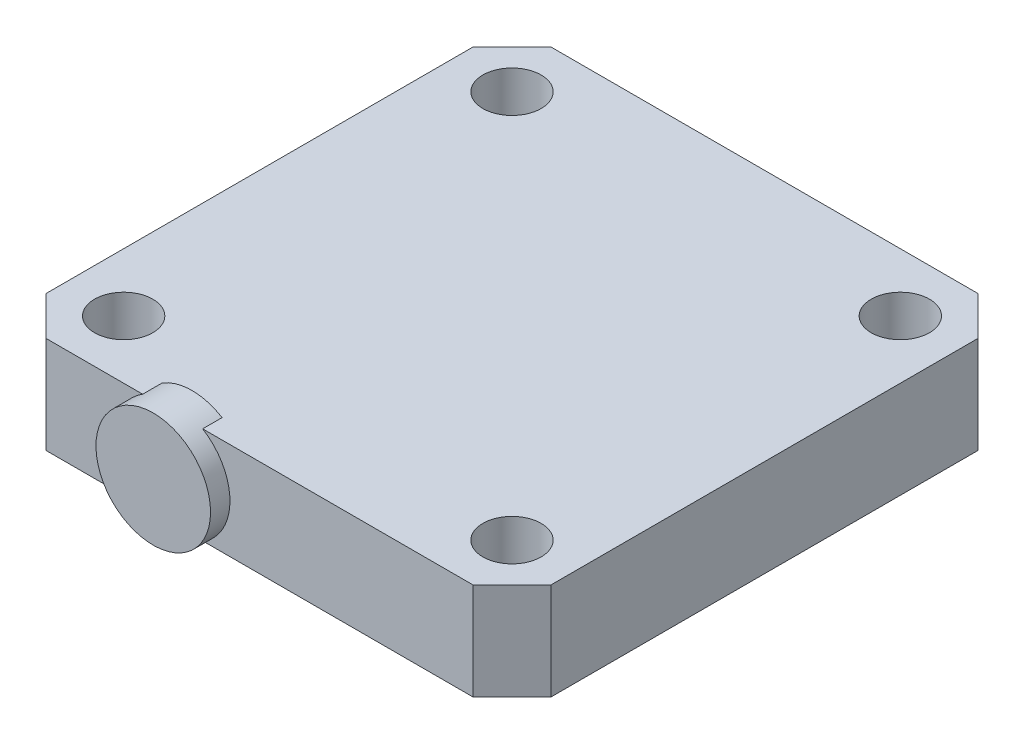
ISO-10303-21;
HEADER;
FILE_DESCRIPTION(('STEP AP214'),'2;1');
FILE_NAME('part.step','',(''),(''),'','','');
FILE_SCHEMA(('AUTOMOTIVE_DESIGN { 1 0 10303 214 1 1 1 1 }'));
ENDSEC;
DATA;
#1=APPLICATION_CONTEXT('core data for automotive mechanical design processes');
#2=APPLICATION_PROTOCOL_DEFINITION('international standard','automotive_design',2000,#1);
#3=PRODUCT_CONTEXT('',#1,'mechanical');
#4=PRODUCT('Part','Part','',(#3));
#5=PRODUCT_RELATED_PRODUCT_CATEGORY('part','',(#4));
#6=PRODUCT_DEFINITION_FORMATION('','',#4);
#7=PRODUCT_DEFINITION_CONTEXT('part definition',#1,'design');
#8=PRODUCT_DEFINITION('design','',#6,#7);
#9=PRODUCT_DEFINITION_SHAPE('','',#8);
#10=(LENGTH_UNIT() NAMED_UNIT(*) SI_UNIT(.MILLI.,.METRE.));
#11=(NAMED_UNIT(*) PLANE_ANGLE_UNIT() SI_UNIT($,.RADIAN.));
#12=(NAMED_UNIT(*) SI_UNIT($,.STERADIAN.) SOLID_ANGLE_UNIT());
#13=UNCERTAINTY_MEASURE_WITH_UNIT(LENGTH_MEASURE(1.E-05),#10,'distance_accuracy_value','');
#14=(GEOMETRIC_REPRESENTATION_CONTEXT(3) GLOBAL_UNCERTAINTY_ASSIGNED_CONTEXT((#13)) GLOBAL_UNIT_ASSIGNED_CONTEXT((#10,
#11,#12)) REPRESENTATION_CONTEXT('',''));
#15=CARTESIAN_POINT('',(0.,0.,0.));
#16=DIRECTION('',(0.,0.,1.));
#17=DIRECTION('',(1.,0.,0.));
#18=AXIS2_PLACEMENT_3D('',#15,#16,#17);
#19=CARTESIAN_POINT('',(0.,5.,0.));
#20=DIRECTION('',(0.,-1.,0.));
#21=DIRECTION('',(0.,0.,-1.));
#22=AXIS2_PLACEMENT_3D('',#19,#20,#21);
#23=PLANE('',#22);
#24=CARTESIAN_POINT('',(-10.,5.,10.));
#25=DIRECTION('',(0.,1.,0.));
#26=DIRECTION('',(0.,0.,1.));
#27=AXIS2_PLACEMENT_3D('',#24,#25,#26);
#28=CIRCLE('',#27,1.5);
#29=CARTESIAN_POINT('',(-10.,5.,11.5));
#30=VERTEX_POINT('',#29);
#31=EDGE_CURVE('E226',#30,#30,#28,.T.);
#32=ORIENTED_EDGE('',*,*,#31,.F.);
#33=EDGE_LOOP('',(#32));
#34=FACE_BOUND('',#33,.T.);
#35=CARTESIAN_POINT('',(10.,5.,10.));
#36=DIRECTION('',(0.,1.,0.));
#37=DIRECTION('',(0.,0.,1.));
#38=AXIS2_PLACEMENT_3D('',#35,#36,#37);
#39=CIRCLE('',#38,1.5);
#40=CARTESIAN_POINT('',(10.,5.,11.5));
#41=VERTEX_POINT('',#40);
#42=EDGE_CURVE('E220',#41,#41,#39,.T.);
#43=ORIENTED_EDGE('',*,*,#42,.F.);
#44=EDGE_LOOP('',(#43));
#45=FACE_BOUND('',#44,.T.);
#46=CARTESIAN_POINT('',(10.,5.,-10.));
#47=DIRECTION('',(0.,1.,0.));
#48=DIRECTION('',(0.,0.,1.));
#49=AXIS2_PLACEMENT_3D('',#46,#47,#48);
#50=CIRCLE('',#49,1.5);
#51=CARTESIAN_POINT('',(10.,5.,-8.5));
#52=VERTEX_POINT('',#51);
#53=EDGE_CURVE('E214',#52,#52,#50,.T.);
#54=ORIENTED_EDGE('',*,*,#53,.F.);
#55=EDGE_LOOP('',(#54));
#56=FACE_BOUND('',#55,.T.);
#57=CARTESIAN_POINT('',(-10.,5.,-9.99999999999999));
#58=DIRECTION('',(0.,1.,0.));
#59=DIRECTION('',(0.,0.,1.));
#60=AXIS2_PLACEMENT_3D('',#57,#58,#59);
#61=CIRCLE('',#60,1.5);
#62=CARTESIAN_POINT('',(-10.,5.,-8.49999999999999));
#63=VERTEX_POINT('',#62);
#64=EDGE_CURVE('E194',#63,#63,#61,.T.);
#65=ORIENTED_EDGE('',*,*,#64,.F.);
#66=EDGE_LOOP('',(#65));
#67=FACE_BOUND('',#66,.T.);
#68=DIRECTION('',(0.,0.,-1.));
#69=VECTOR('',#68,1.);
#70=CARTESIAN_POINT('',(-6.0206778383415,5.,14.));
#71=LINE('',#70,#69);
#72=CARTESIAN_POINT('',(-6.0206778383415,5.,12.));
#73=VERTEX_POINT('',#72);
#74=CARTESIAN_POINT('',(-6.0206778383415,5.,13.));
#75=VERTEX_POINT('',#74);
#76=EDGE_CURVE('E58',#73,#75,#71,.F.);
#77=ORIENTED_EDGE('',*,*,#76,.F.);
#78=DIRECTION('',(-1.,0.,0.));
#79=VECTOR('',#78,1.);
#80=CARTESIAN_POINT('',(0.,5.,12.));
#81=LINE('',#80,#79);
#82=CARTESIAN_POINT('',(-2.93184259864385,5.,12.));
#83=VERTEX_POINT('',#82);
#84=EDGE_CURVE('E62',#83,#73,#81,.T.);
#85=ORIENTED_EDGE('',*,*,#84,.F.);
#86=DIRECTION('',(0.,0.,-1.));
#87=VECTOR('',#86,1.);
#88=CARTESIAN_POINT('',(-2.93184259864385,5.,14.));
#89=LINE('',#88,#87);
#90=CARTESIAN_POINT('',(-2.93184259864385,5.,13.));
#91=VERTEX_POINT('',#90);
#92=EDGE_CURVE('E235',#91,#83,#89,.T.);
#93=ORIENTED_EDGE('',*,*,#92,.F.);
#94=DIRECTION('',(1.,0.,0.));
#95=VECTOR('',#94,1.);
#96=CARTESIAN_POINT('',(11.,5.,13.));
#97=LINE('',#96,#95);
#98=CARTESIAN_POINT('',(11.,5.,13.));
#99=VERTEX_POINT('',#98);
#100=EDGE_CURVE('E202',#91,#99,#97,.T.);
#101=ORIENTED_EDGE('',*,*,#100,.T.);
#102=DIRECTION('',(0.707106781186548,0.,-0.707106781186548));
#103=VECTOR('',#102,1.);
#104=CARTESIAN_POINT('',(13.,5.,11.));
#105=LINE('',#104,#103);
#106=CARTESIAN_POINT('',(13.,5.,11.));
#107=VERTEX_POINT('',#106);
#108=EDGE_CURVE('E198',#99,#107,#105,.T.);
#109=ORIENTED_EDGE('',*,*,#108,.T.);
#110=DIRECTION('',(0.,0.,-1.));
#111=VECTOR('',#110,1.);
#112=CARTESIAN_POINT('',(13.,5.,11.));
#113=LINE('',#112,#111);
#114=CARTESIAN_POINT('',(13.,5.,-11.));
#115=VERTEX_POINT('',#114);
#116=EDGE_CURVE('E196',#107,#115,#113,.T.);
#117=ORIENTED_EDGE('',*,*,#116,.T.);
#118=DIRECTION('',(-0.707106781186548,0.,-0.707106781186548));
#119=VECTOR('',#118,1.);
#120=CARTESIAN_POINT('',(13.,5.,-11.));
#121=LINE('',#120,#119);
#122=CARTESIAN_POINT('',(11.,5.,-13.));
#123=VERTEX_POINT('',#122);
#124=EDGE_CURVE('E178',#115,#123,#121,.T.);
#125=ORIENTED_EDGE('',*,*,#124,.T.);
#126=DIRECTION('',(-1.,0.,0.));
#127=VECTOR('',#126,1.);
#128=CARTESIAN_POINT('',(11.,5.,-13.));
#129=LINE('',#128,#127);
#130=CARTESIAN_POINT('',(-11.,5.,-13.));
#131=VERTEX_POINT('',#130);
#132=EDGE_CURVE('E181',#123,#131,#129,.T.);
#133=ORIENTED_EDGE('',*,*,#132,.T.);
#134=DIRECTION('',(-0.707106781186548,0.,0.707106781186548));
#135=VECTOR('',#134,1.);
#136=CARTESIAN_POINT('',(-11.,5.,-13.));
#137=LINE('',#136,#135);
#138=CARTESIAN_POINT('',(-13.,5.,-11.));
#139=VERTEX_POINT('',#138);
#140=EDGE_CURVE('E207',#131,#139,#137,.T.);
#141=ORIENTED_EDGE('',*,*,#140,.T.);
#142=DIRECTION('',(0.,0.,1.));
#143=VECTOR('',#142,1.);
#144=CARTESIAN_POINT('',(-13.,5.,11.));
#145=LINE('',#144,#143);
#146=CARTESIAN_POINT('',(-13.,5.,11.));
#147=VERTEX_POINT('',#146);
#148=EDGE_CURVE('E205',#139,#147,#145,.T.);
#149=ORIENTED_EDGE('',*,*,#148,.T.);
#150=DIRECTION('',(0.707106781186548,0.,0.707106781186548));
#151=VECTOR('',#150,1.);
#152=CARTESIAN_POINT('',(-11.,5.,13.));
#153=LINE('',#152,#151);
#154=CARTESIAN_POINT('',(-11.,5.,13.));
#155=VERTEX_POINT('',#154);
#156=EDGE_CURVE('E203',#147,#155,#153,.T.);
#157=ORIENTED_EDGE('',*,*,#156,.T.);
#158=EDGE_CURVE('E200',#155,#75,#97,.T.);
#159=ORIENTED_EDGE('',*,*,#158,.T.);
#160=EDGE_LOOP('',(#77,#85,#93,#101,#109,#117,#125,#133,#141,#149,#157,#159));
#161=FACE_BOUND('',#160,.T.);
#162=ADVANCED_FACE('F43',(#34,#45,#56,#67,#161),#23,.F.);
#163=CARTESIAN_POINT('',(0.,0.,0.));
#164=DIRECTION('',(0.,-1.,0.));
#165=DIRECTION('',(0.,0.,-1.));
#166=AXIS2_PLACEMENT_3D('',#163,#164,#165);
#167=PLANE('',#166);
#168=CARTESIAN_POINT('',(10.,0.,10.));
#169=DIRECTION('',(0.,1.,0.));
#170=DIRECTION('',(0.,0.,1.));
#171=AXIS2_PLACEMENT_3D('',#168,#169,#170);
#172=CIRCLE('',#171,1.5);
#173=CARTESIAN_POINT('',(10.,0.,11.5));
#174=VERTEX_POINT('',#173);
#175=EDGE_CURVE('E223',#174,#174,#172,.T.);
#176=ORIENTED_EDGE('',*,*,#175,.T.);
#177=EDGE_LOOP('',(#176));
#178=FACE_BOUND('',#177,.T.);
#179=CARTESIAN_POINT('',(-10.,0.,-9.99999999999999));
#180=DIRECTION('',(0.,1.,0.));
#181=DIRECTION('',(0.,0.,1.));
#182=AXIS2_PLACEMENT_3D('',#179,#180,#181);
#183=CIRCLE('',#182,1.5);
#184=CARTESIAN_POINT('',(-10.,0.,-8.49999999999999));
#185=VERTEX_POINT('',#184);
#186=EDGE_CURVE('E211',#185,#185,#183,.T.);
#187=ORIENTED_EDGE('',*,*,#186,.T.);
#188=EDGE_LOOP('',(#187));
#189=FACE_BOUND('',#188,.T.);
#190=CARTESIAN_POINT('',(10.,0.,-10.));
#191=DIRECTION('',(0.,1.,0.));
#192=DIRECTION('',(0.,0.,1.));
#193=AXIS2_PLACEMENT_3D('',#190,#191,#192);
#194=CIRCLE('',#193,1.5);
#195=CARTESIAN_POINT('',(10.,0.,-8.5));
#196=VERTEX_POINT('',#195);
#197=EDGE_CURVE('E217',#196,#196,#194,.T.);
#198=ORIENTED_EDGE('',*,*,#197,.T.);
#199=EDGE_LOOP('',(#198));
#200=FACE_BOUND('',#199,.T.);
#201=CARTESIAN_POINT('',(-10.,0.,10.));
#202=DIRECTION('',(0.,1.,0.));
#203=DIRECTION('',(0.,0.,1.));
#204=AXIS2_PLACEMENT_3D('',#201,#202,#203);
#205=CIRCLE('',#204,1.5);
#206=CARTESIAN_POINT('',(-10.,0.,11.5));
#207=VERTEX_POINT('',#206);
#208=EDGE_CURVE('E229',#207,#207,#205,.T.);
#209=ORIENTED_EDGE('',*,*,#208,.T.);
#210=EDGE_LOOP('',(#209));
#211=FACE_BOUND('',#210,.T.);
#212=DIRECTION('',(-1.,0.,0.));
#213=VECTOR('',#212,1.);
#214=CARTESIAN_POINT('',(0.,0.,12.));
#215=LINE('',#214,#213);
#216=CARTESIAN_POINT('',(-2.88774457044834,0.,12.));
#217=VERTEX_POINT('',#216);
#218=CARTESIAN_POINT('',(-6.064775866537,0.,12.));
#219=VERTEX_POINT('',#218);
#220=EDGE_CURVE('E11',#217,#219,#215,.T.);
#221=ORIENTED_EDGE('',*,*,#220,.T.);
#222=DIRECTION('',(0.,0.,-1.));
#223=VECTOR('',#222,1.);
#224=CARTESIAN_POINT('',(-6.064775866537,0.,14.));
#225=LINE('',#224,#223);
#226=CARTESIAN_POINT('',(-6.064775866537,0.,13.));
#227=VERTEX_POINT('',#226);
#228=EDGE_CURVE('E144',#219,#227,#225,.F.);
#229=ORIENTED_EDGE('',*,*,#228,.T.);
#230=DIRECTION('',(1.,0.,0.));
#231=VECTOR('',#230,1.);
#232=CARTESIAN_POINT('',(11.,0.,13.));
#233=LINE('',#232,#231);
#234=CARTESIAN_POINT('',(-11.,0.,13.));
#235=VERTEX_POINT('',#234);
#236=EDGE_CURVE('E130',#235,#227,#233,.T.);
#237=ORIENTED_EDGE('',*,*,#236,.F.);
#238=DIRECTION('',(0.707106781186548,0.,0.707106781186548));
#239=VECTOR('',#238,1.);
#240=CARTESIAN_POINT('',(-11.,0.,13.));
#241=LINE('',#240,#239);
#242=CARTESIAN_POINT('',(-13.,0.,11.));
#243=VERTEX_POINT('',#242);
#244=EDGE_CURVE('E185',#243,#235,#241,.T.);
#245=ORIENTED_EDGE('',*,*,#244,.F.);
#246=DIRECTION('',(0.,0.,1.));
#247=VECTOR('',#246,1.);
#248=CARTESIAN_POINT('',(-13.,0.,11.));
#249=LINE('',#248,#247);
#250=CARTESIAN_POINT('',(-13.,0.,-11.));
#251=VERTEX_POINT('',#250);
#252=EDGE_CURVE('E187',#251,#243,#249,.T.);
#253=ORIENTED_EDGE('',*,*,#252,.F.);
#254=DIRECTION('',(-0.707106781186548,0.,0.707106781186548));
#255=VECTOR('',#254,1.);
#256=CARTESIAN_POINT('',(-11.,0.,-13.));
#257=LINE('',#256,#255);
#258=CARTESIAN_POINT('',(-11.,0.,-13.));
#259=VERTEX_POINT('',#258);
#260=EDGE_CURVE('E189',#259,#251,#257,.T.);
#261=ORIENTED_EDGE('',*,*,#260,.F.);
#262=DIRECTION('',(-1.,0.,0.));
#263=VECTOR('',#262,1.);
#264=CARTESIAN_POINT('',(11.,0.,-13.));
#265=LINE('',#264,#263);
#266=CARTESIAN_POINT('',(11.,0.,-13.));
#267=VERTEX_POINT('',#266);
#268=EDGE_CURVE('E191',#267,#259,#265,.T.);
#269=ORIENTED_EDGE('',*,*,#268,.F.);
#270=DIRECTION('',(-0.707106781186548,0.,-0.707106781186548));
#271=VECTOR('',#270,1.);
#272=CARTESIAN_POINT('',(13.,0.,-11.));
#273=LINE('',#272,#271);
#274=CARTESIAN_POINT('',(13.,0.,-11.));
#275=VERTEX_POINT('',#274);
#276=EDGE_CURVE('E179',#275,#267,#273,.T.);
#277=ORIENTED_EDGE('',*,*,#276,.F.);
#278=DIRECTION('',(0.,0.,-1.));
#279=VECTOR('',#278,1.);
#280=CARTESIAN_POINT('',(13.,0.,11.));
#281=LINE('',#280,#279);
#282=CARTESIAN_POINT('',(13.,0.,11.));
#283=VERTEX_POINT('',#282);
#284=EDGE_CURVE('E182',#283,#275,#281,.T.);
#285=ORIENTED_EDGE('',*,*,#284,.F.);
#286=DIRECTION('',(0.707106781186548,0.,-0.707106781186548));
#287=VECTOR('',#286,1.);
#288=CARTESIAN_POINT('',(13.,0.,11.));
#289=LINE('',#288,#287);
#290=CARTESIAN_POINT('',(11.,0.,13.));
#291=VERTEX_POINT('',#290);
#292=EDGE_CURVE('E140',#291,#283,#289,.T.);
#293=ORIENTED_EDGE('',*,*,#292,.F.);
#294=CARTESIAN_POINT('',(-2.88774457044834,0.,13.));
#295=VERTEX_POINT('',#294);
#296=EDGE_CURVE('E141',#295,#291,#233,.T.);
#297=ORIENTED_EDGE('',*,*,#296,.F.);
#298=DIRECTION('',(0.,0.,-1.));
#299=VECTOR('',#298,1.);
#300=CARTESIAN_POINT('',(-2.88774457044834,0.,14.));
#301=LINE('',#300,#299);
#302=EDGE_CURVE('E237',#295,#217,#301,.T.);
#303=ORIENTED_EDGE('',*,*,#302,.T.);
#304=EDGE_LOOP('',(#221,#229,#237,#245,#253,#261,#269,#277,#285,#293,#297,#303));
#305=FACE_BOUND('',#304,.T.);
#306=ADVANCED_FACE('F145',(#178,#189,#200,#211,#305),#167,.T.);
#307=CARTESIAN_POINT('',(11.,5.,13.));
#308=DIRECTION('',(0.,0.,-1.));
#309=DIRECTION('',(-1.,0.,0.));
#310=AXIS2_PLACEMENT_3D('',#307,#308,#309);
#311=PLANE('',#310);
#312=CARTESIAN_POINT('',(-4.47626021849267,2.48618438204178,13.));
#313=DIRECTION('',(0.,0.,-1.));
#314=DIRECTION('',(-1.,0.,0.));
#315=AXIS2_PLACEMENT_3D('',#312,#313,#314);
#316=CIRCLE('',#315,2.95033807310114);
#317=EDGE_CURVE('E51',#295,#91,#316,.F.);
#318=ORIENTED_EDGE('',*,*,#317,.F.);
#319=ORIENTED_EDGE('',*,*,#296,.T.);
#320=DIRECTION('',(0.,-1.,0.));
#321=VECTOR('',#320,1.);
#322=CARTESIAN_POINT('',(11.,5.,13.));
#323=LINE('',#322,#321);
#324=EDGE_CURVE('E166',#99,#291,#323,.T.);
#325=ORIENTED_EDGE('',*,*,#324,.F.);
#326=ORIENTED_EDGE('',*,*,#100,.F.);
#327=EDGE_LOOP('',(#318,#319,#325,#326));
#328=FACE_BOUND('',#327,.T.);
#329=ADVANCED_FACE('F268',(#328),#311,.F.);
#330=CARTESIAN_POINT('',(11.,5.,-13.));
#331=DIRECTION('',(0.,0.,1.));
#332=DIRECTION('',(1.,0.,0.));
#333=AXIS2_PLACEMENT_3D('',#330,#331,#332);
#334=PLANE('',#333);
#335=ORIENTED_EDGE('',*,*,#268,.T.);
#336=DIRECTION('',(0.,-1.,0.));
#337=VECTOR('',#336,1.);
#338=CARTESIAN_POINT('',(-11.,5.,-13.));
#339=LINE('',#338,#337);
#340=EDGE_CURVE('E155',#131,#259,#339,.T.);
#341=ORIENTED_EDGE('',*,*,#340,.F.);
#342=ORIENTED_EDGE('',*,*,#132,.F.);
#343=DIRECTION('',(0.,-1.,0.));
#344=VECTOR('',#343,1.);
#345=CARTESIAN_POINT('',(11.,5.,-13.));
#346=LINE('',#345,#344);
#347=EDGE_CURVE('E175',#123,#267,#346,.T.);
#348=ORIENTED_EDGE('',*,*,#347,.T.);
#349=EDGE_LOOP('',(#335,#341,#342,#348));
#350=FACE_BOUND('',#349,.T.);
#351=ADVANCED_FACE('F45',(#350),#334,.F.);
#352=CARTESIAN_POINT('',(-11.,5.,-13.));
#353=DIRECTION('',(0.707106781186548,0.,0.707106781186548));
#354=DIRECTION('',(0.707106781186548,0.,-0.707106781186548));
#355=AXIS2_PLACEMENT_3D('',#352,#353,#354);
#356=PLANE('',#355);
#357=ORIENTED_EDGE('',*,*,#260,.T.);
#358=DIRECTION('',(0.,-1.,0.));
#359=VECTOR('',#358,1.);
#360=CARTESIAN_POINT('',(-13.,5.,-11.));
#361=LINE('',#360,#359);
#362=EDGE_CURVE('E157',#139,#251,#361,.T.);
#363=ORIENTED_EDGE('',*,*,#362,.F.);
#364=ORIENTED_EDGE('',*,*,#140,.F.);
#365=ORIENTED_EDGE('',*,*,#340,.T.);
#366=EDGE_LOOP('',(#357,#363,#364,#365));
#367=FACE_BOUND('',#366,.T.);
#368=ADVANCED_FACE('F297',(#367),#356,.F.);
#369=CARTESIAN_POINT('',(-13.,5.,11.));
#370=DIRECTION('',(1.,0.,0.));
#371=DIRECTION('',(0.,0.,-1.));
#372=AXIS2_PLACEMENT_3D('',#369,#370,#371);
#373=PLANE('',#372);
#374=ORIENTED_EDGE('',*,*,#252,.T.);
#375=DIRECTION('',(0.,-1.,0.));
#376=VECTOR('',#375,1.);
#377=CARTESIAN_POINT('',(-13.,5.,11.));
#378=LINE('',#377,#376);
#379=EDGE_CURVE('E162',#147,#243,#378,.T.);
#380=ORIENTED_EDGE('',*,*,#379,.F.);
#381=ORIENTED_EDGE('',*,*,#148,.F.);
#382=ORIENTED_EDGE('',*,*,#362,.T.);
#383=EDGE_LOOP('',(#374,#380,#381,#382));
#384=FACE_BOUND('',#383,.T.);
#385=ADVANCED_FACE('F294',(#384),#373,.F.);
#386=CARTESIAN_POINT('',(-11.,5.,13.));
#387=DIRECTION('',(0.707106781186548,0.,-0.707106781186548));
#388=DIRECTION('',(-0.707106781186548,0.,-0.707106781186548));
#389=AXIS2_PLACEMENT_3D('',#386,#387,#388);
#390=PLANE('',#389);
#391=ORIENTED_EDGE('',*,*,#244,.T.);
#392=DIRECTION('',(0.,-1.,0.));
#393=VECTOR('',#392,1.);
#394=CARTESIAN_POINT('',(-11.,5.,13.));
#395=LINE('',#394,#393);
#396=EDGE_CURVE('E137',#155,#235,#395,.T.);
#397=ORIENTED_EDGE('',*,*,#396,.F.);
#398=ORIENTED_EDGE('',*,*,#156,.F.);
#399=ORIENTED_EDGE('',*,*,#379,.T.);
#400=EDGE_LOOP('',(#391,#397,#398,#399));
#401=FACE_BOUND('',#400,.T.);
#402=ADVANCED_FACE('F291',(#401),#390,.F.);
#403=EDGE_CURVE('E135',#75,#227,#316,.F.);
#404=ORIENTED_EDGE('',*,*,#403,.F.);
#405=ORIENTED_EDGE('',*,*,#158,.F.);
#406=ORIENTED_EDGE('',*,*,#396,.T.);
#407=ORIENTED_EDGE('',*,*,#236,.T.);
#408=EDGE_LOOP('',(#404,#405,#406,#407));
#409=FACE_BOUND('',#408,.T.);
#410=ADVANCED_FACE('F132',(#409),#311,.F.);
#411=CARTESIAN_POINT('',(13.,5.,11.));
#412=DIRECTION('',(-0.707106781186548,0.,-0.707106781186548));
#413=DIRECTION('',(-0.707106781186548,0.,0.707106781186548));
#414=AXIS2_PLACEMENT_3D('',#411,#412,#413);
#415=PLANE('',#414);
#416=ORIENTED_EDGE('',*,*,#292,.T.);
#417=DIRECTION('',(0.,-1.,0.));
#418=VECTOR('',#417,1.);
#419=CARTESIAN_POINT('',(13.,5.,11.));
#420=LINE('',#419,#418);
#421=EDGE_CURVE('E169',#107,#283,#420,.T.);
#422=ORIENTED_EDGE('',*,*,#421,.F.);
#423=ORIENTED_EDGE('',*,*,#108,.F.);
#424=ORIENTED_EDGE('',*,*,#324,.T.);
#425=EDGE_LOOP('',(#416,#422,#423,#424));
#426=FACE_BOUND('',#425,.T.);
#427=ADVANCED_FACE('F284',(#426),#415,.F.);
#428=CARTESIAN_POINT('',(13.,5.,11.));
#429=DIRECTION('',(-1.,0.,0.));
#430=DIRECTION('',(0.,0.,1.));
#431=AXIS2_PLACEMENT_3D('',#428,#429,#430);
#432=PLANE('',#431);
#433=ORIENTED_EDGE('',*,*,#284,.T.);
#434=DIRECTION('',(0.,-1.,0.));
#435=VECTOR('',#434,1.);
#436=CARTESIAN_POINT('',(13.,5.,-11.));
#437=LINE('',#436,#435);
#438=EDGE_CURVE('E172',#115,#275,#437,.T.);
#439=ORIENTED_EDGE('',*,*,#438,.F.);
#440=ORIENTED_EDGE('',*,*,#116,.F.);
#441=ORIENTED_EDGE('',*,*,#421,.T.);
#442=EDGE_LOOP('',(#433,#439,#440,#441));
#443=FACE_BOUND('',#442,.T.);
#444=ADVANCED_FACE('F280',(#443),#432,.F.);
#445=CARTESIAN_POINT('',(13.,5.,-11.));
#446=DIRECTION('',(-0.707106781186548,0.,0.707106781186548));
#447=DIRECTION('',(0.707106781186548,0.,0.707106781186548));
#448=AXIS2_PLACEMENT_3D('',#445,#446,#447);
#449=PLANE('',#448);
#450=ORIENTED_EDGE('',*,*,#276,.T.);
#451=ORIENTED_EDGE('',*,*,#347,.F.);
#452=ORIENTED_EDGE('',*,*,#124,.F.);
#453=ORIENTED_EDGE('',*,*,#438,.T.);
#454=EDGE_LOOP('',(#450,#451,#452,#453));
#455=FACE_BOUND('',#454,.T.);
#456=ADVANCED_FACE('F277',(#455),#449,.F.);
#457=CARTESIAN_POINT('',(-10.,5.,-9.99999999999999));
#458=DIRECTION('',(0.,-1.,0.));
#459=DIRECTION('',(0.,0.,-1.));
#460=AXIS2_PLACEMENT_3D('',#457,#458,#459);
#461=CYLINDRICAL_SURFACE('',#460,1.5);
#462=ORIENTED_EDGE('',*,*,#64,.T.);
#463=EDGE_LOOP('',(#462));
#464=FACE_BOUND('',#463,.T.);
#465=ORIENTED_EDGE('',*,*,#186,.F.);
#466=EDGE_LOOP('',(#465));
#467=FACE_BOUND('',#466,.T.);
#468=ADVANCED_FACE('F274',(#464,#467),#461,.F.);
#469=CARTESIAN_POINT('',(10.,5.,-10.));
#470=DIRECTION('',(0.,-1.,0.));
#471=DIRECTION('',(0.,0.,-1.));
#472=AXIS2_PLACEMENT_3D('',#469,#470,#471);
#473=CYLINDRICAL_SURFACE('',#472,1.5);
#474=ORIENTED_EDGE('',*,*,#53,.T.);
#475=EDGE_LOOP('',(#474));
#476=FACE_BOUND('',#475,.T.);
#477=ORIENTED_EDGE('',*,*,#197,.F.);
#478=EDGE_LOOP('',(#477));
#479=FACE_BOUND('',#478,.T.);
#480=ADVANCED_FACE('F404',(#476,#479),#473,.F.);
#481=CARTESIAN_POINT('',(10.,5.,10.));
#482=DIRECTION('',(0.,-1.,0.));
#483=DIRECTION('',(0.,0.,-1.));
#484=AXIS2_PLACEMENT_3D('',#481,#482,#483);
#485=CYLINDRICAL_SURFACE('',#484,1.5);
#486=ORIENTED_EDGE('',*,*,#42,.T.);
#487=EDGE_LOOP('',(#486));
#488=FACE_BOUND('',#487,.T.);
#489=ORIENTED_EDGE('',*,*,#175,.F.);
#490=EDGE_LOOP('',(#489));
#491=FACE_BOUND('',#490,.T.);
#492=ADVANCED_FACE('F395',(#488,#491),#485,.F.);
#493=CARTESIAN_POINT('',(-10.,5.,10.));
#494=DIRECTION('',(0.,-1.,0.));
#495=DIRECTION('',(0.,0.,-1.));
#496=AXIS2_PLACEMENT_3D('',#493,#494,#495);
#497=CYLINDRICAL_SURFACE('',#496,1.5);
#498=ORIENTED_EDGE('',*,*,#31,.T.);
#499=EDGE_LOOP('',(#498));
#500=FACE_BOUND('',#499,.T.);
#501=ORIENTED_EDGE('',*,*,#208,.F.);
#502=EDGE_LOOP('',(#501));
#503=FACE_BOUND('',#502,.T.);
#504=ADVANCED_FACE('F257',(#500,#503),#497,.F.);
#505=CARTESIAN_POINT('',(-4.47626021849267,2.48618438204178,12.));
#506=DIRECTION('',(0.,0.,1.));
#507=DIRECTION('',(1.,0.,0.));
#508=AXIS2_PLACEMENT_3D('',#505,#506,#507);
#509=PLANE('',#508);
#510=CARTESIAN_POINT('',(-4.47626021849267,2.48618438204178,12.));
#511=DIRECTION('',(0.,0.,1.));
#512=DIRECTION('',(1.,0.,0.));
#513=AXIS2_PLACEMENT_3D('',#510,#511,#512);
#514=CIRCLE('',#513,2.95033807310114);
#515=EDGE_CURVE('E240',#83,#73,#514,.T.);
#516=ORIENTED_EDGE('',*,*,#515,.F.);
#517=ORIENTED_EDGE('',*,*,#84,.T.);
#518=EDGE_LOOP('',(#516,#517));
#519=FACE_BOUND('',#518,.T.);
#520=ADVANCED_FACE('F249',(#519),#509,.F.);
#521=CARTESIAN_POINT('',(-4.47626021849267,2.48618438204178,14.));
#522=DIRECTION('',(0.,0.,-1.));
#523=DIRECTION('',(-1.,0.,0.));
#524=AXIS2_PLACEMENT_3D('',#521,#522,#523);
#525=CYLINDRICAL_SURFACE('',#524,2.95033807310114);
#526=CARTESIAN_POINT('',(-4.47626021849267,2.48618438204178,14.));
#527=DIRECTION('',(0.,0.,1.));
#528=DIRECTION('',(1.,0.,0.));
#529=AXIS2_PLACEMENT_3D('',#526,#527,#528);
#530=CIRCLE('',#529,2.95033807310114);
#531=CARTESIAN_POINT('',(-1.52592214539153,2.48618438204178,14.));
#532=VERTEX_POINT('',#531);
#533=EDGE_CURVE('E150',#532,#532,#530,.T.);
#534=ORIENTED_EDGE('',*,*,#533,.F.);
#535=EDGE_LOOP('',(#534));
#536=FACE_BOUND('',#535,.T.);
#537=ORIENTED_EDGE('',*,*,#317,.T.);
#538=ORIENTED_EDGE('',*,*,#92,.T.);
#539=ORIENTED_EDGE('',*,*,#515,.T.);
#540=ORIENTED_EDGE('',*,*,#76,.T.);
#541=ORIENTED_EDGE('',*,*,#403,.T.);
#542=ORIENTED_EDGE('',*,*,#228,.F.);
#543=EDGE_CURVE('E242',#219,#217,#514,.T.);
#544=ORIENTED_EDGE('',*,*,#543,.T.);
#545=ORIENTED_EDGE('',*,*,#302,.F.);
#546=EDGE_LOOP('',(#537,#538,#539,#540,#541,#542,#544,#545));
#547=FACE_BOUND('',#546,.T.);
#548=ADVANCED_FACE('F153',(#536,#547),#525,.T.);
#549=CARTESIAN_POINT('',(-4.47626021849267,2.48618438204178,14.));
#550=DIRECTION('',(0.,0.,1.));
#551=DIRECTION('',(1.,0.,0.));
#552=AXIS2_PLACEMENT_3D('',#549,#550,#551);
#553=PLANE('',#552);
#554=ORIENTED_EDGE('',*,*,#533,.T.);
#555=EDGE_LOOP('',(#554));
#556=FACE_BOUND('',#555,.T.);
#557=ADVANCED_FACE('F246',(#556),#553,.T.);
#558=ORIENTED_EDGE('',*,*,#220,.F.);
#559=ORIENTED_EDGE('',*,*,#543,.F.);
#560=EDGE_LOOP('',(#558,#559));
#561=FACE_BOUND('',#560,.T.);
#562=ADVANCED_FACE('F255',(#561),#509,.F.);
#563=CLOSED_SHELL('',(#162,#306,#329,#351,#368,#385,#402,#410,#427,#444,#456,#468,#480,#492,
#504,#520,#548,#557,#562));
#564=MANIFOLD_SOLID_BREP('B2',#563);
#565=ADVANCED_BREP_SHAPE_REPRESENTATION('',(#18,#564),#14);
#566=SHAPE_DEFINITION_REPRESENTATION(#9,#565);
ENDSEC;
END-ISO-10303-21;
